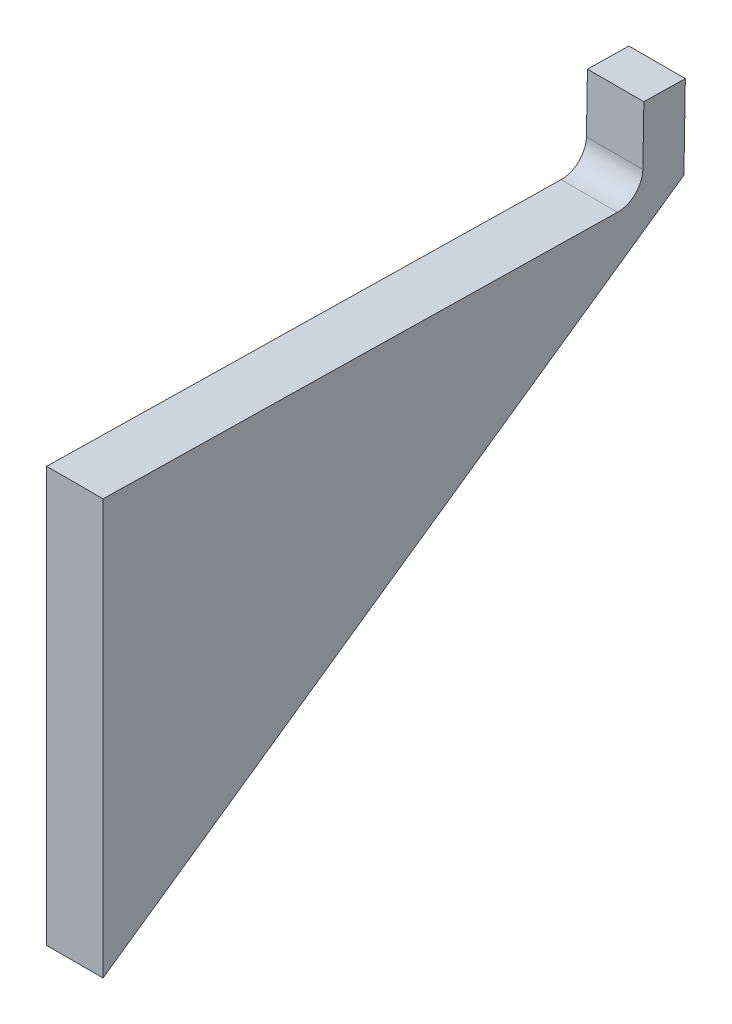
ISO-10303-21;
HEADER;
FILE_DESCRIPTION(('STEP AP214'),'2;1');
FILE_NAME('part.step','',(''),(''),'','','');
FILE_SCHEMA(('AUTOMOTIVE_DESIGN { 1 0 10303 214 1 1 1 1 }'));
ENDSEC;
DATA;
#1=APPLICATION_CONTEXT('core data for automotive mechanical design processes');
#2=APPLICATION_PROTOCOL_DEFINITION('international standard','automotive_design',2000,#1);
#3=PRODUCT_CONTEXT('',#1,'mechanical');
#4=PRODUCT('Part','Part','',(#3));
#5=PRODUCT_RELATED_PRODUCT_CATEGORY('part','',(#4));
#6=PRODUCT_DEFINITION_FORMATION('','',#4);
#7=PRODUCT_DEFINITION_CONTEXT('part definition',#1,'design');
#8=PRODUCT_DEFINITION('design','',#6,#7);
#9=PRODUCT_DEFINITION_SHAPE('','',#8);
#10=(LENGTH_UNIT() NAMED_UNIT(*) SI_UNIT(.MILLI.,.METRE.));
#11=(NAMED_UNIT(*) PLANE_ANGLE_UNIT() SI_UNIT($,.RADIAN.));
#12=(NAMED_UNIT(*) SI_UNIT($,.STERADIAN.) SOLID_ANGLE_UNIT());
#13=UNCERTAINTY_MEASURE_WITH_UNIT(LENGTH_MEASURE(1.E-05),#10,'distance_accuracy_value','');
#14=(GEOMETRIC_REPRESENTATION_CONTEXT(3) GLOBAL_UNCERTAINTY_ASSIGNED_CONTEXT((#13)) GLOBAL_UNIT_ASSIGNED_CONTEXT((#10,
#11,#12)) REPRESENTATION_CONTEXT('',''));
#15=CARTESIAN_POINT('',(0.,0.,0.));
#16=DIRECTION('',(0.,0.,1.));
#17=DIRECTION('',(1.,0.,0.));
#18=AXIS2_PLACEMENT_3D('',#15,#16,#17);
#19=CARTESIAN_POINT('',(6.8,-1.13440641842306,-64.9901001851654));
#20=DIRECTION('',(0.,0.0174524064372778,0.999847695156391));
#21=DIRECTION('',(0.,-0.999847695156391,0.0174524064372778));
#22=AXIS2_PLACEMENT_3D('',#19,#20,#21);
#23=PLANE('',#22);
#24=DIRECTION('',(0.,0.999847695156391,-0.0174524064372778));
#25=VECTOR('',#24,1.);
#26=CARTESIAN_POINT('',(0.,-1.13440641842306,-64.9901001851654));
#27=LINE('',#26,#25);
#28=CARTESIAN_POINT('',(0.,1.86513666704621,-65.0424574044773));
#29=VERTEX_POINT('',#28);
#30=CARTESIAN_POINT('',(0.,8.86407053314095,-65.1646242495382));
#31=VERTEX_POINT('',#30);
#32=EDGE_CURVE('E127',#29,#31,#27,.T.);
#33=ORIENTED_EDGE('',*,*,#32,.F.);
#34=DIRECTION('',(-1.,0.,0.));
#35=VECTOR('',#34,1.);
#36=CARTESIAN_POINT('',(6.8,1.86513666704621,-65.0424574044773));
#37=LINE('',#36,#35);
#38=CARTESIAN_POINT('',(6.8,1.86513666704621,-65.0424574044773));
#39=VERTEX_POINT('',#38);
#40=EDGE_CURVE('E11',#39,#29,#37,.T.);
#41=ORIENTED_EDGE('',*,*,#40,.F.);
#42=DIRECTION('',(0.,0.999847695156391,-0.0174524064372778));
#43=VECTOR('',#42,1.);
#44=CARTESIAN_POINT('',(6.8,-1.13440641842306,-64.9901001851654));
#45=LINE('',#44,#43);
#46=CARTESIAN_POINT('',(6.8,8.86407053314095,-65.1646242495382));
#47=VERTEX_POINT('',#46);
#48=EDGE_CURVE('E143',#39,#47,#45,.T.);
#49=ORIENTED_EDGE('',*,*,#48,.T.);
#50=DIRECTION('',(-1.,0.,0.));
#51=VECTOR('',#50,1.);
#52=CARTESIAN_POINT('',(6.8,8.86407053314095,-65.1646242495382));
#53=LINE('',#52,#51);
#54=EDGE_CURVE('E54',#47,#31,#53,.T.);
#55=ORIENTED_EDGE('',*,*,#54,.T.);
#56=EDGE_LOOP('',(#33,#41,#49,#55));
#57=FACE_BOUND('',#56,.T.);
#58=ADVANCED_FACE('F38',(#57),#23,.T.);
#59=CARTESIAN_POINT('',(6.8,1.91749388635804,-62.0429143190081));
#60=DIRECTION('',(-1.,0.,0.));
#61=DIRECTION('',(0.,0.,1.));
#62=AXIS2_PLACEMENT_3D('',#59,#60,#61);
#63=CYLINDRICAL_SURFACE('',#62,2.99999999999999);
#64=CARTESIAN_POINT('',(0.,1.91749388635804,-62.0429143190081));
#65=DIRECTION('',(1.,0.,0.));
#66=DIRECTION('',(0.,0.,-1.));
#67=AXIS2_PLACEMENT_3D('',#64,#65,#66);
#68=CIRCLE('',#67,2.99999999999999);
#69=CARTESIAN_POINT('',(0.,-1.08204919911114,-61.9905570996963));
#70=VERTEX_POINT('',#69);
#71=EDGE_CURVE('E129',#29,#70,#68,.F.);
#72=ORIENTED_EDGE('',*,*,#71,.T.);
#73=DIRECTION('',(-1.,0.,0.));
#74=VECTOR('',#73,1.);
#75=CARTESIAN_POINT('',(6.8,-1.08204919911114,-61.9905570996963));
#76=LINE('',#75,#74);
#77=CARTESIAN_POINT('',(6.8,-1.08204919911114,-61.9905570996963));
#78=VERTEX_POINT('',#77);
#79=EDGE_CURVE('E46',#78,#70,#76,.T.);
#80=ORIENTED_EDGE('',*,*,#79,.F.);
#81=CARTESIAN_POINT('',(6.8,1.91749388635804,-62.0429143190081));
#82=DIRECTION('',(1.,0.,0.));
#83=DIRECTION('',(0.,0.,-1.));
#84=AXIS2_PLACEMENT_3D('',#81,#82,#83);
#85=CIRCLE('',#84,2.99999999999999);
#86=EDGE_CURVE('E234',#39,#78,#85,.F.);
#87=ORIENTED_EDGE('',*,*,#86,.F.);
#88=ORIENTED_EDGE('',*,*,#40,.T.);
#89=EDGE_LOOP('',(#72,#80,#87,#88));
#90=FACE_BOUND('',#89,.T.);
#91=ADVANCED_FACE('F169',(#90),#63,.F.);
#92=CARTESIAN_POINT('',(6.8,0.,0.));
#93=DIRECTION('',(0.,-0.999847695156391,0.0174524064372764));
#94=DIRECTION('',(0.,-0.0174524064372764,-0.999847695156391));
#95=AXIS2_PLACEMENT_3D('',#92,#93,#94);
#96=PLANE('',#95);
#97=DIRECTION('',(0.,0.0174524064372764,0.999847695156391));
#98=VECTOR('',#97,1.);
#99=CARTESIAN_POINT('',(0.,0.,0.));
#100=LINE('',#99,#98);
#101=CARTESIAN_POINT('',(0.,0.,0.));
#102=VERTEX_POINT('',#101);
#103=EDGE_CURVE('E131',#70,#102,#100,.T.);
#104=ORIENTED_EDGE('',*,*,#103,.T.);
#105=DIRECTION('',(-1.,0.,0.));
#106=VECTOR('',#105,1.);
#107=CARTESIAN_POINT('',(6.8,0.,0.));
#108=LINE('',#107,#106);
#109=CARTESIAN_POINT('',(6.8,0.,0.));
#110=VERTEX_POINT('',#109);
#111=EDGE_CURVE('E147',#110,#102,#108,.T.);
#112=ORIENTED_EDGE('',*,*,#111,.F.);
#113=DIRECTION('',(0.,0.0174524064372764,0.999847695156391));
#114=VECTOR('',#113,1.);
#115=CARTESIAN_POINT('',(6.8,0.,0.));
#116=LINE('',#115,#114);
#117=EDGE_CURVE('E122',#78,#110,#116,.T.);
#118=ORIENTED_EDGE('',*,*,#117,.F.);
#119=ORIENTED_EDGE('',*,*,#79,.T.);
#120=EDGE_LOOP('',(#104,#112,#118,#119));
#121=FACE_BOUND('',#120,.T.);
#122=ADVANCED_FACE('F153',(#121),#96,.F.);
#123=CARTESIAN_POINT('',(6.8,0.,0.));
#124=DIRECTION('',(0.,0.,1.));
#125=DIRECTION('',(1.,0.,0.));
#126=AXIS2_PLACEMENT_3D('',#123,#124,#125);
#127=PLANE('',#126);
#128=DIRECTION('',(0.,1.,0.));
#129=VECTOR('',#128,1.);
#130=CARTESIAN_POINT('',(0.,0.,0.));
#131=LINE('',#130,#129);
#132=CARTESIAN_POINT('',(0.,-50.,0.));
#133=VERTEX_POINT('',#132);
#134=EDGE_CURVE('E134',#133,#102,#131,.T.);
#135=ORIENTED_EDGE('',*,*,#134,.F.);
#136=DIRECTION('',(-1.,0.,0.));
#137=VECTOR('',#136,1.);
#138=CARTESIAN_POINT('',(6.8,-50.,0.));
#139=LINE('',#138,#137);
#140=CARTESIAN_POINT('',(6.8,-50.,0.));
#141=VERTEX_POINT('',#140);
#142=EDGE_CURVE('E108',#141,#133,#139,.T.);
#143=ORIENTED_EDGE('',*,*,#142,.F.);
#144=DIRECTION('',(0.,1.,0.));
#145=VECTOR('',#144,1.);
#146=CARTESIAN_POINT('',(6.8,0.,0.));
#147=LINE('',#146,#145);
#148=EDGE_CURVE('E120',#141,#110,#147,.T.);
#149=ORIENTED_EDGE('',*,*,#148,.T.);
#150=ORIENTED_EDGE('',*,*,#111,.T.);
#151=EDGE_LOOP('',(#135,#143,#149,#150));
#152=FACE_BOUND('',#151,.T.);
#153=ADVANCED_FACE('F161',(#152),#127,.T.);
#154=CARTESIAN_POINT('',(6.8,-33.6536124277075,-23.4545303076192));
#155=DIRECTION('',(0.,-0.820409805252321,-0.571775962633836));
#156=DIRECTION('',(0.,0.571775962633836,-0.820409805252321));
#157=AXIS2_PLACEMENT_3D('',#154,#155,#156);
#158=PLANE('',#157);
#159=DIRECTION('',(0.,-0.571775962633836,0.820409805252321));
#160=VECTOR('',#159,1.);
#161=CARTESIAN_POINT('',(0.,-33.6536124277075,-23.4545303076192));
#162=LINE('',#161,#160);
#163=CARTESIAN_POINT('',(0.,-1.22166845060935,-69.9893386609474));
#164=VERTEX_POINT('',#163);
#165=EDGE_CURVE('E105',#164,#133,#162,.T.);
#166=ORIENTED_EDGE('',*,*,#165,.F.);
#167=DIRECTION('',(-1.,0.,0.));
#168=VECTOR('',#167,1.);
#169=CARTESIAN_POINT('',(6.8,-1.22166845060935,-69.9893386609474));
#170=LINE('',#169,#168);
#171=CARTESIAN_POINT('',(6.8,-1.22166845060935,-69.9893386609474));
#172=VERTEX_POINT('',#171);
#173=EDGE_CURVE('E99',#172,#164,#170,.T.);
#174=ORIENTED_EDGE('',*,*,#173,.F.);
#175=DIRECTION('',(0.,-0.571775962633836,0.820409805252321));
#176=VECTOR('',#175,1.);
#177=CARTESIAN_POINT('',(6.8,-33.6536124277075,-23.4545303076192));
#178=LINE('',#177,#176);
#179=EDGE_CURVE('E103',#172,#141,#178,.T.);
#180=ORIENTED_EDGE('',*,*,#179,.T.);
#181=ORIENTED_EDGE('',*,*,#142,.T.);
#182=EDGE_LOOP('',(#166,#174,#180,#181));
#183=FACE_BOUND('',#182,.T.);
#184=ADVANCED_FACE('F101',(#183),#158,.T.);
#185=CARTESIAN_POINT('',(6.8,-1.22166845060936,-69.9893386609474));
#186=DIRECTION('',(0.,0.0174524064372766,0.999847695156391));
#187=DIRECTION('',(0.,-0.999847695156391,0.0174524064372766));
#188=AXIS2_PLACEMENT_3D('',#185,#186,#187);
#189=PLANE('',#188);
#190=DIRECTION('',(0.,0.999847695156391,-0.0174524064372766));
#191=VECTOR('',#190,1.);
#192=CARTESIAN_POINT('',(0.,-1.22166845060936,-69.9893386609474));
#193=LINE('',#192,#191);
#194=CARTESIAN_POINT('',(0.,8.77680850095456,-70.1638627253201));
#195=VERTEX_POINT('',#194);
#196=EDGE_CURVE('E138',#164,#195,#193,.T.);
#197=ORIENTED_EDGE('',*,*,#196,.T.);
#198=DIRECTION('',(-1.,0.,0.));
#199=VECTOR('',#198,1.);
#200=CARTESIAN_POINT('',(6.8,8.77680850095456,-70.1638627253201));
#201=LINE('',#200,#199);
#202=CARTESIAN_POINT('',(6.8,8.77680850095456,-70.1638627253201));
#203=VERTEX_POINT('',#202);
#204=EDGE_CURVE('E77',#203,#195,#201,.T.);
#205=ORIENTED_EDGE('',*,*,#204,.F.);
#206=DIRECTION('',(0.,0.999847695156391,-0.0174524064372766));
#207=VECTOR('',#206,1.);
#208=CARTESIAN_POINT('',(6.8,-1.22166845060936,-69.9893386609474));
#209=LINE('',#208,#207);
#210=EDGE_CURVE('E110',#172,#203,#209,.T.);
#211=ORIENTED_EDGE('',*,*,#210,.F.);
#212=ORIENTED_EDGE('',*,*,#173,.T.);
#213=EDGE_LOOP('',(#197,#205,#211,#212));
#214=FACE_BOUND('',#213,.T.);
#215=ADVANCED_FACE('F111',(#214),#189,.F.);
#216=CARTESIAN_POINT('',(6.8,9.99847695156393,-0.174524064372767));
#217=DIRECTION('',(0.,0.999847695156391,-0.0174524064372766));
#218=DIRECTION('',(0.,0.0174524064372766,0.999847695156391));
#219=AXIS2_PLACEMENT_3D('',#216,#217,#218);
#220=PLANE('',#219);
#221=DIRECTION('',(0.,-0.0174524064372766,-0.999847695156391));
#222=VECTOR('',#221,1.);
#223=CARTESIAN_POINT('',(0.,9.99847695156393,-0.174524064372767));
#224=LINE('',#223,#222);
#225=EDGE_CURVE('E140',#31,#195,#224,.T.);
#226=ORIENTED_EDGE('',*,*,#225,.F.);
#227=ORIENTED_EDGE('',*,*,#54,.F.);
#228=DIRECTION('',(0.,-0.0174524064372766,-0.999847695156391));
#229=VECTOR('',#228,1.);
#230=CARTESIAN_POINT('',(6.8,9.99847695156393,-0.174524064372767));
#231=LINE('',#230,#229);
#232=EDGE_CURVE('E114',#47,#203,#231,.T.);
#233=ORIENTED_EDGE('',*,*,#232,.T.);
#234=ORIENTED_EDGE('',*,*,#204,.T.);
#235=EDGE_LOOP('',(#226,#227,#233,#234));
#236=FACE_BOUND('',#235,.T.);
#237=ADVANCED_FACE('F175',(#236),#220,.T.);
#238=CARTESIAN_POINT('',(6.8,0.,0.));
#239=DIRECTION('',(1.,0.,0.));
#240=DIRECTION('',(0.,0.,-1.));
#241=AXIS2_PLACEMENT_3D('',#238,#239,#240);
#242=PLANE('',#241);
#243=ORIENTED_EDGE('',*,*,#48,.F.);
#244=ORIENTED_EDGE('',*,*,#86,.T.);
#245=ORIENTED_EDGE('',*,*,#117,.T.);
#246=ORIENTED_EDGE('',*,*,#148,.F.);
#247=ORIENTED_EDGE('',*,*,#179,.F.);
#248=ORIENTED_EDGE('',*,*,#210,.T.);
#249=ORIENTED_EDGE('',*,*,#232,.F.);
#250=EDGE_LOOP('',(#243,#244,#245,#246,#247,#248,#249));
#251=FACE_BOUND('',#250,.T.);
#252=ADVANCED_FACE('F118',(#251),#242,.T.);
#253=CARTESIAN_POINT('',(0.,0.,0.));
#254=DIRECTION('',(1.,0.,0.));
#255=DIRECTION('',(0.,0.,-1.));
#256=AXIS2_PLACEMENT_3D('',#253,#254,#255);
#257=PLANE('',#256);
#258=ORIENTED_EDGE('',*,*,#32,.T.);
#259=ORIENTED_EDGE('',*,*,#225,.T.);
#260=ORIENTED_EDGE('',*,*,#196,.F.);
#261=ORIENTED_EDGE('',*,*,#165,.T.);
#262=ORIENTED_EDGE('',*,*,#134,.T.);
#263=ORIENTED_EDGE('',*,*,#103,.F.);
#264=ORIENTED_EDGE('',*,*,#71,.F.);
#265=EDGE_LOOP('',(#258,#259,#260,#261,#262,#263,#264));
#266=FACE_BOUND('',#265,.T.);
#267=ADVANCED_FACE('F158',(#266),#257,.F.);
#268=CLOSED_SHELL('',(#58,#91,#122,#153,#184,#215,#237,#252,#267));
#269=MANIFOLD_SOLID_BREP('B2',#268);
#270=ADVANCED_BREP_SHAPE_REPRESENTATION('',(#18,#269),#14);
#271=SHAPE_DEFINITION_REPRESENTATION(#9,#270);
ENDSEC;
END-ISO-10303-21;
